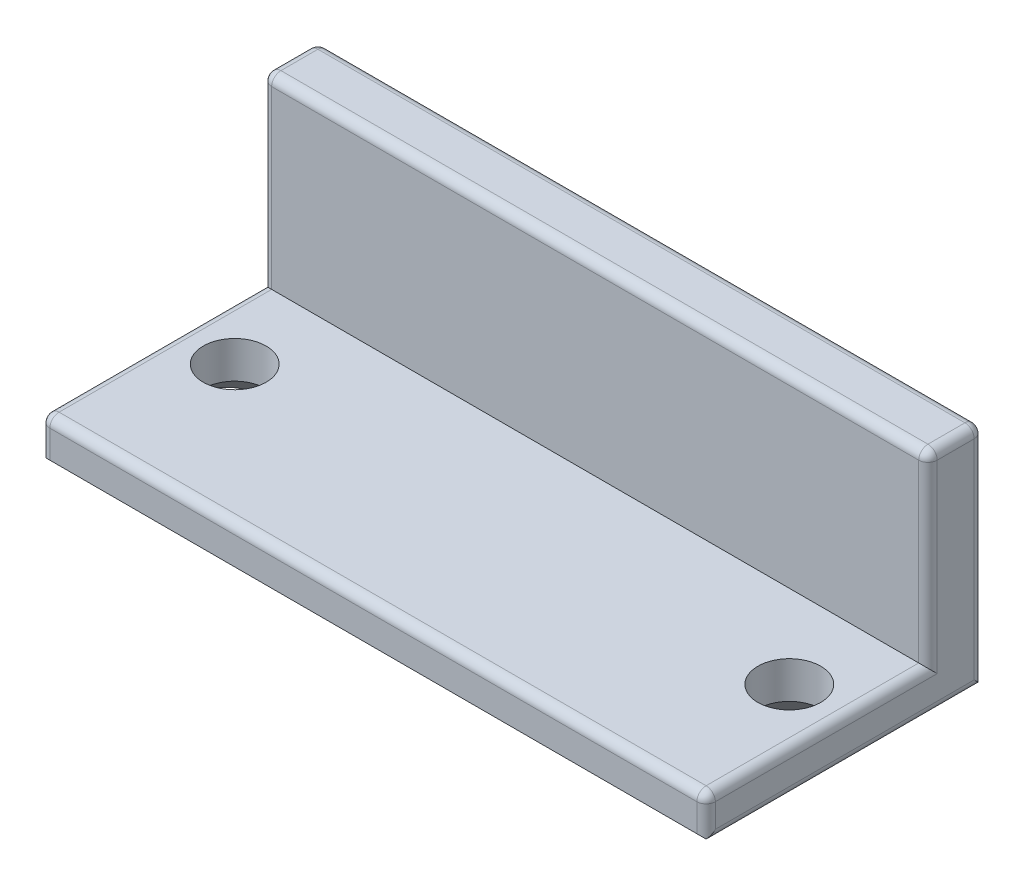
ISO-10303-21;
HEADER;
FILE_DESCRIPTION(('STEP AP214'),'2;1');
FILE_NAME('part.step','',(''),(''),'','','');
FILE_SCHEMA(('AUTOMOTIVE_DESIGN { 1 0 10303 214 1 1 1 1 }'));
ENDSEC;
DATA;
#1=APPLICATION_CONTEXT('core data for automotive mechanical design processes');
#2=APPLICATION_PROTOCOL_DEFINITION('international standard','automotive_design',2000,#1);
#3=PRODUCT_CONTEXT('',#1,'mechanical');
#4=PRODUCT('Part','Part','',(#3));
#5=PRODUCT_RELATED_PRODUCT_CATEGORY('part','',(#4));
#6=PRODUCT_DEFINITION_FORMATION('','',#4);
#7=PRODUCT_DEFINITION_CONTEXT('part definition',#1,'design');
#8=PRODUCT_DEFINITION('design','',#6,#7);
#9=PRODUCT_DEFINITION_SHAPE('','',#8);
#10=(LENGTH_UNIT() NAMED_UNIT(*) SI_UNIT(.MILLI.,.METRE.));
#11=(NAMED_UNIT(*) PLANE_ANGLE_UNIT() SI_UNIT($,.RADIAN.));
#12=(NAMED_UNIT(*) SI_UNIT($,.STERADIAN.) SOLID_ANGLE_UNIT());
#13=UNCERTAINTY_MEASURE_WITH_UNIT(LENGTH_MEASURE(1.E-05),#10,'distance_accuracy_value','');
#14=(GEOMETRIC_REPRESENTATION_CONTEXT(3) GLOBAL_UNCERTAINTY_ASSIGNED_CONTEXT((#13)) GLOBAL_UNIT_ASSIGNED_CONTEXT((#10,
#11,#12)) REPRESENTATION_CONTEXT('',''));
#15=CARTESIAN_POINT('',(0.,0.,0.));
#16=DIRECTION('',(0.,0.,1.));
#17=DIRECTION('',(1.,0.,0.));
#18=AXIS2_PLACEMENT_3D('',#15,#16,#17);
#19=CARTESIAN_POINT('',(0.,4.,0.));
#20=DIRECTION('',(0.,-1.,0.));
#21=DIRECTION('',(0.,0.,-1.));
#22=AXIS2_PLACEMENT_3D('',#19,#20,#21);
#23=PLANE('',#22);
#24=CARTESIAN_POINT('',(15.,4.,0.));
#25=DIRECTION('',(0.,-1.,0.));
#26=DIRECTION('',(0.,0.,-1.));
#27=AXIS2_PLACEMENT_3D('',#24,#25,#26);
#28=CIRCLE('',#27,1.7);
#29=CARTESIAN_POINT('',(15.,4.,-1.7));
#30=VERTEX_POINT('',#29);
#31=EDGE_CURVE('E211',#30,#30,#28,.T.);
#32=ORIENTED_EDGE('',*,*,#31,.T.);
#33=EDGE_LOOP('',(#32));
#34=FACE_BOUND('',#33,.T.);
#35=CARTESIAN_POINT('',(-15.,4.,0.));
#36=DIRECTION('',(0.,-1.,0.));
#37=DIRECTION('',(0.,0.,-1.));
#38=AXIS2_PLACEMENT_3D('',#35,#36,#37);
#39=CIRCLE('',#38,1.7);
#40=CARTESIAN_POINT('',(-15.,4.,-1.7));
#41=VERTEX_POINT('',#40);
#42=EDGE_CURVE('E207',#41,#41,#39,.T.);
#43=ORIENTED_EDGE('',*,*,#42,.T.);
#44=EDGE_LOOP('',(#43));
#45=FACE_BOUND('',#44,.T.);
#46=DIRECTION('',(0.,0.,1.));
#47=VECTOR('',#46,1.);
#48=CARTESIAN_POINT('',(-17.5,4.,0.));
#49=LINE('',#48,#47);
#50=CARTESIAN_POINT('',(-17.5,4.,-4.5));
#51=VERTEX_POINT('',#50);
#52=CARTESIAN_POINT('',(-17.5,4.,7.));
#53=VERTEX_POINT('',#52);
#54=EDGE_CURVE('E508',#51,#53,#49,.T.);
#55=ORIENTED_EDGE('',*,*,#54,.T.);
#56=DIRECTION('',(1.,0.,0.));
#57=VECTOR('',#56,1.);
#58=CARTESIAN_POINT('',(0.,4.,7.));
#59=LINE('',#58,#57);
#60=CARTESIAN_POINT('',(17.5,4.,7.));
#61=VERTEX_POINT('',#60);
#62=EDGE_CURVE('E49',#53,#61,#59,.T.);
#63=ORIENTED_EDGE('',*,*,#62,.T.);
#64=DIRECTION('',(0.,0.,-1.));
#65=VECTOR('',#64,1.);
#66=CARTESIAN_POINT('',(17.5,4.,0.));
#67=LINE('',#66,#65);
#68=CARTESIAN_POINT('',(17.5,4.,-4.5));
#69=VERTEX_POINT('',#68);
#70=EDGE_CURVE('E506',#61,#69,#67,.T.);
#71=ORIENTED_EDGE('',*,*,#70,.T.);
#72=DIRECTION('',(1.,0.,0.));
#73=VECTOR('',#72,1.);
#74=CARTESIAN_POINT('',(-18.,4.,-4.5));
#75=LINE('',#74,#73);
#76=EDGE_CURVE('E559',#51,#69,#75,.T.);
#77=ORIENTED_EDGE('',*,*,#76,.F.);
#78=EDGE_LOOP('',(#55,#63,#71,#77));
#79=FACE_BOUND('',#78,.T.);
#80=ADVANCED_FACE('F40',(#34,#45,#79),#23,.F.);
#81=CARTESIAN_POINT('',(18.,4.,7.5));
#82=DIRECTION('',(-1.,0.,0.));
#83=DIRECTION('',(0.,0.,1.));
#84=AXIS2_PLACEMENT_3D('',#81,#82,#83);
#85=PLANE('',#84);
#86=DIRECTION('',(0.,-1.,0.));
#87=VECTOR('',#86,1.);
#88=CARTESIAN_POINT('',(18.,4.,-5.));
#89=LINE('',#88,#87);
#90=CARTESIAN_POINT('',(18.,13.5,-5.));
#91=VERTEX_POINT('',#90);
#92=CARTESIAN_POINT('',(18.,3.5,-5.));
#93=VERTEX_POINT('',#92);
#94=EDGE_CURVE('E542',#91,#93,#89,.T.);
#95=ORIENTED_EDGE('',*,*,#94,.T.);
#96=DIRECTION('',(0.,0.,-1.));
#97=VECTOR('',#96,1.);
#98=CARTESIAN_POINT('',(18.,3.5,7.5));
#99=LINE('',#98,#97);
#100=CARTESIAN_POINT('',(18.,3.5,7.));
#101=VERTEX_POINT('',#100);
#102=EDGE_CURVE('E543',#93,#101,#99,.F.);
#103=ORIENTED_EDGE('',*,*,#102,.T.);
#104=DIRECTION('',(0.,-1.,0.));
#105=VECTOR('',#104,1.);
#106=CARTESIAN_POINT('',(18.,4.,7.));
#107=LINE('',#106,#105);
#108=CARTESIAN_POINT('',(18.,2.20710678118658,7.));
#109=VERTEX_POINT('',#108);
#110=EDGE_CURVE('E534',#101,#109,#107,.T.);
#111=ORIENTED_EDGE('',*,*,#110,.T.);
#112=DIRECTION('',(0.,0.,-1.));
#113=VECTOR('',#112,1.);
#114=CARTESIAN_POINT('',(18.,2.20710678118658,-7.5));
#115=LINE('',#114,#113);
#116=CARTESIAN_POINT('',(18.,2.20710678118658,-7.));
#117=VERTEX_POINT('',#116);
#118=EDGE_CURVE('E536',#109,#117,#115,.T.);
#119=ORIENTED_EDGE('',*,*,#118,.T.);
#120=DIRECTION('',(0.,-1.,0.));
#121=VECTOR('',#120,1.);
#122=CARTESIAN_POINT('',(18.,4.,-7.));
#123=LINE('',#122,#121);
#124=CARTESIAN_POINT('',(18.,13.5,-7.));
#125=VERTEX_POINT('',#124);
#126=EDGE_CURVE('E538',#117,#125,#123,.F.);
#127=ORIENTED_EDGE('',*,*,#126,.T.);
#128=DIRECTION('',(0.,0.,-1.));
#129=VECTOR('',#128,1.);
#130=CARTESIAN_POINT('',(18.,13.5,-4.5));
#131=LINE('',#130,#129);
#132=EDGE_CURVE('E540',#125,#91,#131,.F.);
#133=ORIENTED_EDGE('',*,*,#132,.T.);
#134=EDGE_LOOP('',(#95,#103,#111,#119,#127,#133));
#135=FACE_BOUND('',#134,.T.);
#136=ADVANCED_FACE('F334',(#135),#85,.F.);
#137=CARTESIAN_POINT('',(-18.,4.,-7.5));
#138=DIRECTION('',(0.,0.,1.));
#139=DIRECTION('',(1.,0.,0.));
#140=AXIS2_PLACEMENT_3D('',#137,#138,#139);
#141=PLANE('',#140);
#142=DIRECTION('',(-1.,0.,0.));
#143=VECTOR('',#142,1.);
#144=CARTESIAN_POINT('',(-18.,2.00000000000004,-7.5));
#145=LINE('',#144,#143);
#146=CARTESIAN_POINT('',(17.5,2.00000000000004,-7.5));
#147=VERTEX_POINT('',#146);
#148=CARTESIAN_POINT('',(-17.5,2.00000000000004,-7.5));
#149=VERTEX_POINT('',#148);
#150=EDGE_CURVE('E204',#147,#149,#145,.T.);
#151=ORIENTED_EDGE('',*,*,#150,.T.);
#152=DIRECTION('',(0.,-1.,0.));
#153=VECTOR('',#152,1.);
#154=CARTESIAN_POINT('',(-17.5,4.,-7.5));
#155=LINE('',#154,#153);
#156=CARTESIAN_POINT('',(-17.5,13.5,-7.5));
#157=VERTEX_POINT('',#156);
#158=EDGE_CURVE('E528',#149,#157,#155,.F.);
#159=ORIENTED_EDGE('',*,*,#158,.T.);
#160=DIRECTION('',(-1.,0.,0.));
#161=VECTOR('',#160,1.);
#162=CARTESIAN_POINT('',(18.,13.5,-7.5));
#163=LINE('',#162,#161);
#164=CARTESIAN_POINT('',(17.5,13.5,-7.5));
#165=VERTEX_POINT('',#164);
#166=EDGE_CURVE('E526',#157,#165,#163,.F.);
#167=ORIENTED_EDGE('',*,*,#166,.T.);
#168=DIRECTION('',(0.,-1.,0.));
#169=VECTOR('',#168,1.);
#170=CARTESIAN_POINT('',(17.5,4.,-7.5));
#171=LINE('',#170,#169);
#172=EDGE_CURVE('E524',#165,#147,#171,.T.);
#173=ORIENTED_EDGE('',*,*,#172,.T.);
#174=EDGE_LOOP('',(#151,#159,#167,#173));
#175=FACE_BOUND('',#174,.T.);
#176=ADVANCED_FACE('F340',(#175),#141,.F.);
#177=CARTESIAN_POINT('',(-18.,4.,7.5));
#178=DIRECTION('',(1.,0.,0.));
#179=DIRECTION('',(0.,0.,-1.));
#180=AXIS2_PLACEMENT_3D('',#177,#178,#179);
#181=PLANE('',#180);
#182=DIRECTION('',(0.,0.,1.));
#183=VECTOR('',#182,1.);
#184=CARTESIAN_POINT('',(-18.,3.5,7.5));
#185=LINE('',#184,#183);
#186=CARTESIAN_POINT('',(-18.,3.5,7.));
#187=VERTEX_POINT('',#186);
#188=CARTESIAN_POINT('',(-18.,3.5,-5.));
#189=VERTEX_POINT('',#188);
#190=EDGE_CURVE('E505',#187,#189,#185,.F.);
#191=ORIENTED_EDGE('',*,*,#190,.T.);
#192=DIRECTION('',(0.,-1.,0.));
#193=VECTOR('',#192,1.);
#194=CARTESIAN_POINT('',(-18.,4.,-5.));
#195=LINE('',#194,#193);
#196=CARTESIAN_POINT('',(-18.,13.5,-5.));
#197=VERTEX_POINT('',#196);
#198=EDGE_CURVE('E503',#189,#197,#195,.F.);
#199=ORIENTED_EDGE('',*,*,#198,.T.);
#200=DIRECTION('',(0.,0.,1.));
#201=VECTOR('',#200,1.);
#202=CARTESIAN_POINT('',(-18.,13.5,-7.5));
#203=LINE('',#202,#201);
#204=CARTESIAN_POINT('',(-18.,13.5,-7.));
#205=VERTEX_POINT('',#204);
#206=EDGE_CURVE('E497',#197,#205,#203,.F.);
#207=ORIENTED_EDGE('',*,*,#206,.T.);
#208=DIRECTION('',(0.,-1.,0.));
#209=VECTOR('',#208,1.);
#210=CARTESIAN_POINT('',(-18.,4.,-7.));
#211=LINE('',#210,#209);
#212=CARTESIAN_POINT('',(-18.,2.20710678118658,-7.));
#213=VERTEX_POINT('',#212);
#214=EDGE_CURVE('E500',#205,#213,#211,.T.);
#215=ORIENTED_EDGE('',*,*,#214,.T.);
#216=DIRECTION('',(0.,0.,1.));
#217=VECTOR('',#216,1.);
#218=CARTESIAN_POINT('',(-18.,2.20710678118658,7.5));
#219=LINE('',#218,#217);
#220=CARTESIAN_POINT('',(-18.,2.20710678118658,7.));
#221=VERTEX_POINT('',#220);
#222=EDGE_CURVE('E600',#213,#221,#219,.T.);
#223=ORIENTED_EDGE('',*,*,#222,.T.);
#224=DIRECTION('',(0.,-1.,0.));
#225=VECTOR('',#224,1.);
#226=CARTESIAN_POINT('',(-18.,4.,7.));
#227=LINE('',#226,#225);
#228=EDGE_CURVE('E409',#221,#187,#227,.F.);
#229=ORIENTED_EDGE('',*,*,#228,.T.);
#230=EDGE_LOOP('',(#191,#199,#207,#215,#223,#229));
#231=FACE_BOUND('',#230,.T.);
#232=ADVANCED_FACE('F354',(#231),#181,.F.);
#233=CARTESIAN_POINT('',(-18.,4.,7.5));
#234=DIRECTION('',(0.,0.,-1.));
#235=DIRECTION('',(-1.,0.,0.));
#236=AXIS2_PLACEMENT_3D('',#233,#234,#235);
#237=PLANE('',#236);
#238=DIRECTION('',(0.,-1.,0.));
#239=VECTOR('',#238,1.);
#240=CARTESIAN_POINT('',(17.5,4.,7.5));
#241=LINE('',#240,#239);
#242=CARTESIAN_POINT('',(17.5,2.00000000000004,7.5));
#243=VERTEX_POINT('',#242);
#244=CARTESIAN_POINT('',(17.5,3.5,7.5));
#245=VERTEX_POINT('',#244);
#246=EDGE_CURVE('E514',#243,#245,#241,.F.);
#247=ORIENTED_EDGE('',*,*,#246,.T.);
#248=DIRECTION('',(1.,0.,0.));
#249=VECTOR('',#248,1.);
#250=CARTESIAN_POINT('',(-18.,3.5,7.5));
#251=LINE('',#250,#249);
#252=CARTESIAN_POINT('',(-17.5,3.5,7.5));
#253=VERTEX_POINT('',#252);
#254=EDGE_CURVE('E11',#245,#253,#251,.F.);
#255=ORIENTED_EDGE('',*,*,#254,.T.);
#256=DIRECTION('',(0.,-1.,0.));
#257=VECTOR('',#256,1.);
#258=CARTESIAN_POINT('',(-17.5,4.,7.5));
#259=LINE('',#258,#257);
#260=CARTESIAN_POINT('',(-17.5,2.00000000000004,7.5));
#261=VERTEX_POINT('',#260);
#262=EDGE_CURVE('E516',#253,#261,#259,.T.);
#263=ORIENTED_EDGE('',*,*,#262,.T.);
#264=DIRECTION('',(1.,0.,0.));
#265=VECTOR('',#264,1.);
#266=CARTESIAN_POINT('',(18.,2.00000000000004,7.5));
#267=LINE('',#266,#265);
#268=EDGE_CURVE('E554',#261,#243,#267,.T.);
#269=ORIENTED_EDGE('',*,*,#268,.T.);
#270=EDGE_LOOP('',(#247,#255,#263,#269));
#271=FACE_BOUND('',#270,.T.);
#272=ADVANCED_FACE('F351',(#271),#237,.F.);
#273=CARTESIAN_POINT('',(0.,0.,0.));
#274=DIRECTION('',(0.,-1.,0.));
#275=DIRECTION('',(0.,0.,-1.));
#276=AXIS2_PLACEMENT_3D('',#273,#274,#275);
#277=PLANE('',#276);
#278=CARTESIAN_POINT('',(-15.,0.,0.));
#279=DIRECTION('',(0.,-1.,0.));
#280=DIRECTION('',(0.,0.,-1.));
#281=AXIS2_PLACEMENT_3D('',#278,#279,#280);
#282=CIRCLE('',#281,3.7);
#283=CARTESIAN_POINT('',(-16.,0.,3.56230262611138));
#284=VERTEX_POINT('',#283);
#285=CARTESIAN_POINT('',(-16.,0.,-3.56230262611138));
#286=VERTEX_POINT('',#285);
#287=EDGE_CURVE('E571',#284,#286,#282,.F.);
#288=ORIENTED_EDGE('',*,*,#287,.T.);
#289=DIRECTION('',(0.,0.,-1.));
#290=VECTOR('',#289,1.);
#291=CARTESIAN_POINT('',(-16.,0.,-7.5));
#292=LINE('',#291,#290);
#293=CARTESIAN_POINT('',(-16.,0.,-5.49999999999999));
#294=VERTEX_POINT('',#293);
#295=EDGE_CURVE('E573',#286,#294,#292,.T.);
#296=ORIENTED_EDGE('',*,*,#295,.T.);
#297=DIRECTION('',(1.,0.,0.));
#298=VECTOR('',#297,1.);
#299=CARTESIAN_POINT('',(18.,0.,-5.49999999999999));
#300=LINE('',#299,#298);
#301=CARTESIAN_POINT('',(16.,0.,-5.49999999999999));
#302=VERTEX_POINT('',#301);
#303=EDGE_CURVE('E193',#294,#302,#300,.T.);
#304=ORIENTED_EDGE('',*,*,#303,.T.);
#305=DIRECTION('',(0.,0.,1.));
#306=VECTOR('',#305,1.);
#307=CARTESIAN_POINT('',(16.,0.,7.5));
#308=LINE('',#307,#306);
#309=CARTESIAN_POINT('',(16.,0.,-3.56230262611139));
#310=VERTEX_POINT('',#309);
#311=EDGE_CURVE('E186',#302,#310,#308,.T.);
#312=ORIENTED_EDGE('',*,*,#311,.T.);
#313=CARTESIAN_POINT('',(15.,0.,0.));
#314=DIRECTION('',(0.,-1.,0.));
#315=DIRECTION('',(0.,0.,-1.));
#316=AXIS2_PLACEMENT_3D('',#313,#314,#315);
#317=CIRCLE('',#316,3.70000000000001);
#318=CARTESIAN_POINT('',(16.,0.,3.56230262611139));
#319=VERTEX_POINT('',#318);
#320=EDGE_CURVE('E190',#310,#319,#317,.F.);
#321=ORIENTED_EDGE('',*,*,#320,.T.);
#322=DIRECTION('',(0.,0.,1.));
#323=VECTOR('',#322,1.);
#324=CARTESIAN_POINT('',(16.,0.,7.5));
#325=LINE('',#324,#323);
#326=CARTESIAN_POINT('',(16.,0.,5.49999999999999));
#327=VERTEX_POINT('',#326);
#328=EDGE_CURVE('E198',#319,#327,#325,.T.);
#329=ORIENTED_EDGE('',*,*,#328,.T.);
#330=DIRECTION('',(-1.,0.,0.));
#331=VECTOR('',#330,1.);
#332=CARTESIAN_POINT('',(-18.,0.,5.49999999999999));
#333=LINE('',#332,#331);
#334=CARTESIAN_POINT('',(-16.,0.,5.49999999999999));
#335=VERTEX_POINT('',#334);
#336=EDGE_CURVE('E197',#327,#335,#333,.T.);
#337=ORIENTED_EDGE('',*,*,#336,.T.);
#338=DIRECTION('',(0.,0.,-1.));
#339=VECTOR('',#338,1.);
#340=CARTESIAN_POINT('',(-16.,0.,-7.5));
#341=LINE('',#340,#339);
#342=EDGE_CURVE('E393',#335,#284,#341,.T.);
#343=ORIENTED_EDGE('',*,*,#342,.T.);
#344=EDGE_LOOP('',(#288,#296,#304,#312,#321,#329,#337,#343));
#345=FACE_BOUND('',#344,.T.);
#346=ADVANCED_FACE('F188',(#345),#277,.T.);
#347=CARTESIAN_POINT('',(-18.,14.,-4.5));
#348=DIRECTION('',(0.,0.,-1.));
#349=DIRECTION('',(-1.,0.,0.));
#350=AXIS2_PLACEMENT_3D('',#347,#348,#349);
#351=PLANE('',#350);
#352=DIRECTION('',(1.,0.,0.));
#353=VECTOR('',#352,1.);
#354=CARTESIAN_POINT('',(-18.,13.5,-4.5));
#355=LINE('',#354,#353);
#356=CARTESIAN_POINT('',(17.5,13.5,-4.5));
#357=VERTEX_POINT('',#356);
#358=CARTESIAN_POINT('',(-17.5,13.5,-4.5));
#359=VERTEX_POINT('',#358);
#360=EDGE_CURVE('E487',#357,#359,#355,.F.);
#361=ORIENTED_EDGE('',*,*,#360,.T.);
#362=DIRECTION('',(0.,-1.,0.));
#363=VECTOR('',#362,1.);
#364=CARTESIAN_POINT('',(-17.5,14.,-4.5));
#365=LINE('',#364,#363);
#366=EDGE_CURVE('E501',#359,#51,#365,.T.);
#367=ORIENTED_EDGE('',*,*,#366,.T.);
#368=ORIENTED_EDGE('',*,*,#76,.T.);
#369=DIRECTION('',(0.,-1.,0.));
#370=VECTOR('',#369,1.);
#371=CARTESIAN_POINT('',(17.5,14.,-4.5));
#372=LINE('',#371,#370);
#373=EDGE_CURVE('E223',#69,#357,#372,.F.);
#374=ORIENTED_EDGE('',*,*,#373,.T.);
#375=EDGE_LOOP('',(#361,#367,#368,#374));
#376=FACE_BOUND('',#375,.T.);
#377=ADVANCED_FACE('F347',(#376),#351,.F.);
#378=CARTESIAN_POINT('',(0.,14.,0.));
#379=DIRECTION('',(0.,1.,0.));
#380=DIRECTION('',(0.,0.,1.));
#381=AXIS2_PLACEMENT_3D('',#378,#379,#380);
#382=PLANE('',#381);
#383=DIRECTION('',(-1.,0.,0.));
#384=VECTOR('',#383,1.);
#385=CARTESIAN_POINT('',(-18.,14.,-7.));
#386=LINE('',#385,#384);
#387=CARTESIAN_POINT('',(17.5,14.,-7.));
#388=VERTEX_POINT('',#387);
#389=CARTESIAN_POINT('',(-17.5,14.,-7.));
#390=VERTEX_POINT('',#389);
#391=EDGE_CURVE('E492',#388,#390,#386,.T.);
#392=ORIENTED_EDGE('',*,*,#391,.T.);
#393=DIRECTION('',(0.,0.,1.));
#394=VECTOR('',#393,1.);
#395=CARTESIAN_POINT('',(-17.5,14.,-4.5));
#396=LINE('',#395,#394);
#397=CARTESIAN_POINT('',(-17.5,14.,-5.));
#398=VERTEX_POINT('',#397);
#399=EDGE_CURVE('E495',#390,#398,#396,.T.);
#400=ORIENTED_EDGE('',*,*,#399,.T.);
#401=DIRECTION('',(1.,0.,0.));
#402=VECTOR('',#401,1.);
#403=CARTESIAN_POINT('',(18.,14.,-5.));
#404=LINE('',#403,#402);
#405=CARTESIAN_POINT('',(17.5,14.,-5.));
#406=VERTEX_POINT('',#405);
#407=EDGE_CURVE('E488',#398,#406,#404,.T.);
#408=ORIENTED_EDGE('',*,*,#407,.T.);
#409=DIRECTION('',(0.,0.,-1.));
#410=VECTOR('',#409,1.);
#411=CARTESIAN_POINT('',(17.5,14.,-7.5));
#412=LINE('',#411,#410);
#413=EDGE_CURVE('E493',#406,#388,#412,.T.);
#414=ORIENTED_EDGE('',*,*,#413,.T.);
#415=EDGE_LOOP('',(#392,#400,#408,#414));
#416=FACE_BOUND('',#415,.T.);
#417=ADVANCED_FACE('F594',(#416),#382,.T.);
#418=CARTESIAN_POINT('',(-15.,8.,0.));
#419=DIRECTION('',(0.,-1.,0.));
#420=DIRECTION('',(0.,0.,-1.));
#421=AXIS2_PLACEMENT_3D('',#418,#419,#420);
#422=CYLINDRICAL_SURFACE('',#421,1.7);
#423=CARTESIAN_POINT('',(-15.,1.99999999999999,0.));
#424=DIRECTION('',(0.,-1.,0.));
#425=DIRECTION('',(0.,0.,-1.));
#426=AXIS2_PLACEMENT_3D('',#423,#424,#425);
#427=CIRCLE('',#426,1.7);
#428=CARTESIAN_POINT('',(-15.,1.99999999999999,-1.7));
#429=VERTEX_POINT('',#428);
#430=EDGE_CURVE('E576',#429,#429,#427,.T.);
#431=ORIENTED_EDGE('',*,*,#430,.T.);
#432=EDGE_LOOP('',(#431));
#433=FACE_BOUND('',#432,.T.);
#434=ORIENTED_EDGE('',*,*,#42,.F.);
#435=EDGE_LOOP('',(#434));
#436=FACE_BOUND('',#435,.T.);
#437=ADVANCED_FACE('F608',(#433,#436),#422,.F.);
#438=CARTESIAN_POINT('',(15.,8.,0.));
#439=DIRECTION('',(0.,-1.,0.));
#440=DIRECTION('',(0.,0.,-1.));
#441=AXIS2_PLACEMENT_3D('',#438,#439,#440);
#442=CYLINDRICAL_SURFACE('',#441,1.7);
#443=CARTESIAN_POINT('',(15.,2.00000000000001,0.));
#444=DIRECTION('',(0.,-1.,0.));
#445=DIRECTION('',(0.,0.,-1.));
#446=AXIS2_PLACEMENT_3D('',#443,#444,#445);
#447=CIRCLE('',#446,1.7);
#448=CARTESIAN_POINT('',(15.,2.00000000000001,-1.7));
#449=VERTEX_POINT('',#448);
#450=EDGE_CURVE('E579',#449,#449,#447,.T.);
#451=ORIENTED_EDGE('',*,*,#450,.T.);
#452=EDGE_LOOP('',(#451));
#453=FACE_BOUND('',#452,.T.);
#454=ORIENTED_EDGE('',*,*,#31,.F.);
#455=EDGE_LOOP('',(#454));
#456=FACE_BOUND('',#455,.T.);
#457=ADVANCED_FACE('F236',(#453,#456),#442,.F.);
#458=CARTESIAN_POINT('',(15.,2.00000000000001,0.));
#459=DIRECTION('',(0.,-1.,0.));
#460=DIRECTION('',(0.,0.,-1.));
#461=AXIS2_PLACEMENT_3D('',#458,#459,#460);
#462=CONICAL_SURFACE('',#461,1.7,0.785398163397449);
#463=ORIENTED_EDGE('',*,*,#450,.F.);
#464=EDGE_LOOP('',(#463));
#465=FACE_BOUND('',#464,.T.);
#466=CARTESIAN_POINT('',(15.9998,-0.000199999999998704,3.56256649060759));
#467=CARTESIAN_POINT('',(16.0465130595986,0.0465130595985837,3.50093464861042));
#468=CARTESIAN_POINT('',(16.0926643449181,0.0926643449181048,3.43845412136017));
#469=CARTESIAN_POINT('',(16.1837139874336,0.183713987433581,3.31166345949694));
#470=CARTESIAN_POINT('',(16.2286120341937,0.228612034193754,3.24735287939592));
#471=CARTESIAN_POINT('',(16.3615380187308,0.361538018730841,3.05102153464726));
#472=CARTESIAN_POINT('',(16.4474362166133,0.447436216613293,2.91607346024803));
#473=CARTESIAN_POINT('',(16.6136105767967,0.613610576796723,2.63481188906168));
#474=CARTESIAN_POINT('',(16.6937423150924,0.693742315092382,2.48832664163045));
#475=CARTESIAN_POINT('',(16.8441692808538,0.84416928085385,2.18577885023922));
#476=CARTESIAN_POINT('',(16.9144810906658,0.914481090665851,2.02973310781613));
#477=CARTESIAN_POINT('',(17.0148783814284,1.01487838142841,1.77721915827932));
#478=CARTESIAN_POINT('',(17.0492232472894,1.04922324728945,1.68412256704296));
#479=CARTESIAN_POINT('',(17.1132635635296,1.11326356352966,1.49475269889878));
#480=CARTESIAN_POINT('',(17.1429588175248,1.1429588175248,1.39847928802054));
#481=CARTESIAN_POINT('',(17.1969142605689,1.19691426056888,1.20351733869541));
#482=CARTESIAN_POINT('',(17.2212030149292,1.2212030149292,1.10484470460807));
#483=CARTESIAN_POINT('',(17.2639307288815,1.26393072888156,0.905002458351106));
#484=CARTESIAN_POINT('',(17.2823709502057,1.28237095020577,0.803833389832212));
#485=CARTESIAN_POINT('',(17.3130452500828,1.31304525008279,0.598370865799546));
#486=CARTESIAN_POINT('',(17.3252038209756,1.32520382097561,0.494054661944269));
#487=CARTESIAN_POINT('',(17.3425738768034,1.34257387680341,0.284263577501302));
#488=CARTESIAN_POINT('',(17.3477854860983,1.34778548609834,0.178788717689191));
#489=CARTESIAN_POINT('',(17.3510755304681,1.35107553046808,-0.0324572677547005));
#490=CARTESIAN_POINT('',(17.3491490759384,1.34914907593844,-0.138228546856991));
#491=CARTESIAN_POINT('',(17.3382221585016,1.33822215850165,-0.349029898393682));
#492=CARTESIAN_POINT('',(17.3292219004495,1.32922190044951,-0.454059992203689));
#493=CARTESIAN_POINT('',(17.3057415648923,1.30574156489236,-0.651743527903896));
#494=CARTESIAN_POINT('',(17.2919224914374,1.29192249143739,-0.744556111122211));
#495=CARTESIAN_POINT('',(17.2592091991471,1.25920919914716,-0.928382687575615));
#496=CARTESIAN_POINT('',(17.2403133999239,1.24031339992388,-1.01939611124324));
#497=CARTESIAN_POINT('',(17.1766318962636,1.17663189626361,-1.28916582929989));
#498=CARTESIAN_POINT('',(17.1248484969175,1.1248484969175,-1.46468000712414));
#499=CARTESIAN_POINT('',(17.01586430778,1.01586430777999,-1.77804981479558));
#500=CARTESIAN_POINT('',(16.9608263753693,0.960826375369358,-1.91746230480538));
#501=CARTESIAN_POINT('',(16.8422529117401,0.842252911740086,-2.18888758195588));
#502=CARTESIAN_POINT('',(16.7787145493285,0.778714549328565,-2.32089788280983));
#503=CARTESIAN_POINT('',(16.6446914563211,0.644691456321124,-2.57807825988468));
#504=CARTESIAN_POINT('',(16.5741904425753,0.574190442575285,-2.70323118411444));
#505=CARTESIAN_POINT('',(16.4277403386827,0.427740338682694,-2.94687512612109));
#506=CARTESIAN_POINT('',(16.3517932789287,0.351793278928726,-3.06536859758535));
#507=CARTESIAN_POINT('',(16.2292284015712,0.229228401571269,-3.24646817961319));
#508=CARTESIAN_POINT('',(16.1841031655387,0.184103165538681,-3.31111764902292));
#509=CARTESIAN_POINT('',(16.0927688446209,0.0927688446209657,-3.43831242752018));
#510=CARTESIAN_POINT('',(16.0465651689531,0.0465651689531099,-3.50086549860923));
#511=CARTESIAN_POINT('',(15.9998,-0.000199999999971741,-3.56256649060763));
#512=B_SPLINE_CURVE_WITH_KNOTS('',3,(#466,#467,#468,#469,#470,#471,#472,#473,#474,#475,#476,
#477,#478,#479,#480,#481,#482,#483,#484,#485,#486,#487,#488,#489,#490,#491,#492,#493,#494,#495,
#496,#497,#498,#499,#500,#501,#502,#503,#504,#505,#506,#507,#508,#509,#510,#511),.UNSPECIFIED.,
.F.,.F.,(4,2,2,2,2,2,2,2,2,2,2,2,2,2,2,2,2,2,2,2,2,2,4),(0.,0.2710281319389,0.54212281411283,
1.0863972741464,1.64141409836788,2.19548206287321,2.51028672706824,2.82510468397311,
3.13821758361146,3.45126288787701,3.76798834056443,4.08470812336487,4.40164490067658,
4.71857249994258,5.00280907672809,5.28713423927357,5.85569878590708,6.33406032216532,
6.8125815822536,7.29224969727919,7.77173990317003,8.04423220313069,8.31556867965648),.UNSPECIFIED.);
#513=EDGE_CURVE('E202',#319,#310,#512,.T.);
#514=ORIENTED_EDGE('',*,*,#513,.F.);
#515=ORIENTED_EDGE('',*,*,#320,.F.);
#516=EDGE_LOOP('',(#514,#515));
#517=FACE_BOUND('',#516,.T.);
#518=ADVANCED_FACE('F201',(#465,#517),#462,.F.);
#519=CARTESIAN_POINT('',(-18.,2.00000000000004,7.5));
#520=DIRECTION('',(0.,-0.707106781186544,0.707106781186551));
#521=DIRECTION('',(-1.,0.,0.));
#522=AXIS2_PLACEMENT_3D('',#519,#520,#521);
#523=PLANE('',#522);
#524=ORIENTED_EDGE('',*,*,#268,.F.);
#525=CARTESIAN_POINT('',(-17.5,1.50000000000003,7.));
#526=DIRECTION('',(0.,-0.707106781186544,0.707106781186551));
#527=DIRECTION('',(0.,-0.707106781186551,-0.707106781186544));
#528=AXIS2_PLACEMENT_3D('',#525,#526,#527);
#529=ELLIPSE('',#528,0.707106781186551,0.5);
#530=CARTESIAN_POINT('',(-17.8535533905933,1.85355339059331,7.35355339059328));
#531=VERTEX_POINT('',#530);
#532=EDGE_CURVE('E404',#261,#531,#529,.T.);
#533=ORIENTED_EDGE('',*,*,#532,.T.);
#534=DIRECTION('',(0.577350269189624,-0.57735026918963,-0.577350269189624));
#535=VECTOR('',#534,1.);
#536=CARTESIAN_POINT('',(-18.,2.00000000000004,7.5));
#537=LINE('',#536,#535);
#538=EDGE_CURVE('E213',#335,#531,#537,.F.);
#539=ORIENTED_EDGE('',*,*,#538,.F.);
#540=ORIENTED_EDGE('',*,*,#336,.F.);
#541=DIRECTION('',(-0.577350269189624,-0.57735026918963,-0.577350269189624));
#542=VECTOR('',#541,1.);
#543=CARTESIAN_POINT('',(18.,2.00000000000004,7.5));
#544=LINE('',#543,#542);
#545=CARTESIAN_POINT('',(17.8535533905933,1.85355339059331,7.35355339059327));
#546=VERTEX_POINT('',#545);
#547=EDGE_CURVE('E208',#546,#327,#544,.T.);
#548=ORIENTED_EDGE('',*,*,#547,.F.);
#549=CARTESIAN_POINT('',(17.5,1.50000000000003,7.));
#550=DIRECTION('',(0.,-0.707106781186544,0.707106781186551));
#551=DIRECTION('',(0.,-0.707106781186551,-0.707106781186544));
#552=AXIS2_PLACEMENT_3D('',#549,#550,#551);
#553=ELLIPSE('',#552,0.707106781186551,0.5);
#554=EDGE_CURVE('E518',#546,#243,#553,.T.);
#555=ORIENTED_EDGE('',*,*,#554,.T.);
#556=EDGE_LOOP('',(#524,#533,#539,#540,#548,#555));
#557=FACE_BOUND('',#556,.T.);
#558=ADVANCED_FACE('F235',(#557),#523,.T.);
#559=CARTESIAN_POINT('',(-15.,1.99999999999999,0.));
#560=DIRECTION('',(0.,-1.,0.));
#561=DIRECTION('',(0.,0.,-1.));
#562=AXIS2_PLACEMENT_3D('',#559,#560,#561);
#563=CONICAL_SURFACE('',#562,1.7,0.785398163397451);
#564=ORIENTED_EDGE('',*,*,#430,.F.);
#565=EDGE_LOOP('',(#564));
#566=FACE_BOUND('',#565,.T.);
#567=CARTESIAN_POINT('',(-15.9998,-0.000199999999998584,-3.56256649060759));
#568=CARTESIAN_POINT('',(-16.0465130595986,0.0465130595985836,-3.50093464861042));
#569=CARTESIAN_POINT('',(-16.0926643449181,0.0926643449181044,-3.43845412136016));
#570=CARTESIAN_POINT('',(-16.1837139874336,0.18371398743358,-3.31166345949693));
#571=CARTESIAN_POINT('',(-16.2286120341937,0.228612034193754,-3.24735287939592));
#572=CARTESIAN_POINT('',(-16.3615380187308,0.36153801873084,-3.05102153464726));
#573=CARTESIAN_POINT('',(-16.4474362166133,0.44743621661329,-2.91607346024803));
#574=CARTESIAN_POINT('',(-16.6136105767967,0.613610576796719,-2.63481188906168));
#575=CARTESIAN_POINT('',(-16.6937423150924,0.693742315092378,-2.48832664163045));
#576=CARTESIAN_POINT('',(-16.8441692808538,0.844169280853845,-2.18577885023921));
#577=CARTESIAN_POINT('',(-16.9144810906658,0.914481090665845,-2.02973310781613));
#578=CARTESIAN_POINT('',(-17.0148783814284,1.0148783814284,-1.77721915827932));
#579=CARTESIAN_POINT('',(-17.0492232472894,1.04922324728944,-1.68412256704296));
#580=CARTESIAN_POINT('',(-17.1132635635296,1.11326356352965,-1.49475269889877));
#581=CARTESIAN_POINT('',(-17.1429588175248,1.14295881752479,-1.39847928802054));
#582=CARTESIAN_POINT('',(-17.1969142605688,1.19691426056888,-1.20351733869541));
#583=CARTESIAN_POINT('',(-17.2212030149292,1.2212030149292,-1.10484470460807));
#584=CARTESIAN_POINT('',(-17.2639307288815,1.26393072888155,-0.905002458351104));
#585=CARTESIAN_POINT('',(-17.2823709502057,1.28237095020577,-0.80383338983221));
#586=CARTESIAN_POINT('',(-17.3130452500828,1.31304525008278,-0.598370865799544));
#587=CARTESIAN_POINT('',(-17.3252038209756,1.3252038209756,-0.494054661944267));
#588=CARTESIAN_POINT('',(-17.3425738768034,1.34257387680341,-0.284263577501301));
#589=CARTESIAN_POINT('',(-17.3477854860983,1.34778548609834,-0.17878871768919));
#590=CARTESIAN_POINT('',(-17.351075530468,1.35107553046808,0.0324572677547012));
#591=CARTESIAN_POINT('',(-17.3491490759384,1.34914907593843,0.138228546856992));
#592=CARTESIAN_POINT('',(-17.3382221585016,1.33822215850164,0.349029898393682));
#593=CARTESIAN_POINT('',(-17.3292219004495,1.3292219004495,0.45405999220369));
#594=CARTESIAN_POINT('',(-17.3057415648923,1.30574156489235,0.651743527903898));
#595=CARTESIAN_POINT('',(-17.2919224914373,1.29192249143738,0.744556111122212));
#596=CARTESIAN_POINT('',(-17.2592091991471,1.25920919914715,0.928382687575617));
#597=CARTESIAN_POINT('',(-17.2403133999238,1.24031339992387,1.01939611124324));
#598=CARTESIAN_POINT('',(-17.1766318962636,1.1766318962636,1.28916582929989));
#599=CARTESIAN_POINT('',(-17.1248484969175,1.12484849691749,1.46468000712414));
#600=CARTESIAN_POINT('',(-17.01586430778,1.01586430777998,1.77804981479558));
#601=CARTESIAN_POINT('',(-16.9608263753693,0.960826375369348,1.91746230480538));
#602=CARTESIAN_POINT('',(-16.8422529117401,0.842252911740076,2.18888758195588));
#603=CARTESIAN_POINT('',(-16.7787145493285,0.778714549328555,2.32089788280983));
#604=CARTESIAN_POINT('',(-16.6446914563211,0.644691456321114,2.57807825988468));
#605=CARTESIAN_POINT('',(-16.5741904425753,0.574190442575274,2.70323118411445));
#606=CARTESIAN_POINT('',(-16.4277403386827,0.427740338682682,2.94687512612109));
#607=CARTESIAN_POINT('',(-16.3517932789287,0.351793278928714,3.06536859758535));
#608=CARTESIAN_POINT('',(-16.2292284015712,0.229228401571259,3.24646817961319));
#609=CARTESIAN_POINT('',(-16.1841031655387,0.184103165538673,3.31111764902292));
#610=CARTESIAN_POINT('',(-16.0927688446209,0.0927688446209619,3.43831242752018));
#611=CARTESIAN_POINT('',(-16.0465651689531,0.0465651689531081,3.50086549860922));
#612=CARTESIAN_POINT('',(-15.9998,-0.000199999999971379,3.56256649060762));
#613=B_SPLINE_CURVE_WITH_KNOTS('',3,(#567,#568,#569,#570,#571,#572,#573,#574,#575,#576,#577,
#578,#579,#580,#581,#582,#583,#584,#585,#586,#587,#588,#589,#590,#591,#592,#593,#594,#595,#596,
#597,#598,#599,#600,#601,#602,#603,#604,#605,#606,#607,#608,#609,#610,#611,#612),.UNSPECIFIED.,
.F.,.F.,(4,2,2,2,2,2,2,2,2,2,2,2,2,2,2,2,2,2,2,2,2,2,4),(0.,0.271028131938899,0.542122814112829,
1.0863972741464,1.64141409836787,2.1954820628732,2.51028672706823,2.8251046839731,
3.13821758361145,3.451262887877,3.76798834056443,4.08470812336486,4.40164490067657,
4.71857249994257,5.00280907672808,5.28713423927356,5.85569878590707,6.33406032216531,
6.81258158225359,7.29224969727918,7.77173990317002,8.04423220313067,8.31556867965645),.UNSPECIFIED.);
#614=EDGE_CURVE('E376',#286,#284,#613,.T.);
#615=ORIENTED_EDGE('',*,*,#614,.F.);
#616=ORIENTED_EDGE('',*,*,#287,.F.);
#617=EDGE_LOOP('',(#615,#616));
#618=FACE_BOUND('',#617,.T.);
#619=ADVANCED_FACE('F244',(#566,#618),#563,.F.);
#620=CARTESIAN_POINT('',(18.,2.00000000000004,7.5));
#621=DIRECTION('',(0.707106781186551,-0.707106781186544,0.));
#622=DIRECTION('',(0.,0.,1.));
#623=AXIS2_PLACEMENT_3D('',#620,#621,#622);
#624=PLANE('',#623);
#625=DIRECTION('',(0.577350269189624,0.57735026918963,-0.577350269189624));
#626=VECTOR('',#625,1.);
#627=CARTESIAN_POINT('',(13.,-2.99999999999998,-2.50000000000004));
#628=LINE('',#627,#626);
#629=CARTESIAN_POINT('',(17.8535533905933,1.85355339059331,-7.35355339059327));
#630=VERTEX_POINT('',#629);
#631=EDGE_CURVE('E383',#630,#302,#628,.F.);
#632=ORIENTED_EDGE('',*,*,#631,.F.);
#633=DIRECTION('',(0.,0.,-1.));
#634=VECTOR('',#633,1.);
#635=CARTESIAN_POINT('',(17.8535533905933,1.85355339059331,7.5));
#636=LINE('',#635,#634);
#637=EDGE_CURVE('E459',#630,#546,#636,.F.);
#638=ORIENTED_EDGE('',*,*,#637,.T.);
#639=ORIENTED_EDGE('',*,*,#547,.T.);
#640=ORIENTED_EDGE('',*,*,#328,.F.);
#641=ORIENTED_EDGE('',*,*,#513,.T.);
#642=ORIENTED_EDGE('',*,*,#311,.F.);
#643=EDGE_LOOP('',(#632,#638,#639,#640,#641,#642));
#644=FACE_BOUND('',#643,.T.);
#645=ADVANCED_FACE('F206',(#644),#624,.T.);
#646=CARTESIAN_POINT('',(-18.,2.00000000000004,7.5));
#647=DIRECTION('',(-0.707106781186551,-0.707106781186544,0.));
#648=DIRECTION('',(0.,0.,-1.));
#649=AXIS2_PLACEMENT_3D('',#646,#647,#648);
#650=PLANE('',#649);
#651=ORIENTED_EDGE('',*,*,#538,.T.);
#652=DIRECTION('',(0.,0.,1.));
#653=VECTOR('',#652,1.);
#654=CARTESIAN_POINT('',(-17.8535533905933,1.85355339059331,-7.5));
#655=LINE('',#654,#653);
#656=CARTESIAN_POINT('',(-17.8535533905933,1.85355339059331,-7.35355339059327));
#657=VERTEX_POINT('',#656);
#658=EDGE_CURVE('E391',#531,#657,#655,.F.);
#659=ORIENTED_EDGE('',*,*,#658,.T.);
#660=DIRECTION('',(0.577350269189624,-0.57735026918963,0.577350269189624));
#661=VECTOR('',#660,1.);
#662=CARTESIAN_POINT('',(-13.,-2.99999999999998,-2.50000000000004));
#663=LINE('',#662,#661);
#664=EDGE_CURVE('E454',#294,#657,#663,.F.);
#665=ORIENTED_EDGE('',*,*,#664,.F.);
#666=ORIENTED_EDGE('',*,*,#295,.F.);
#667=ORIENTED_EDGE('',*,*,#614,.T.);
#668=ORIENTED_EDGE('',*,*,#342,.F.);
#669=EDGE_LOOP('',(#651,#659,#665,#666,#667,#668));
#670=FACE_BOUND('',#669,.T.);
#671=ADVANCED_FACE('F243',(#670),#650,.T.);
#672=CARTESIAN_POINT('',(-18.,2.00000000000004,-7.5));
#673=DIRECTION('',(0.,-0.707106781186544,-0.707106781186551));
#674=DIRECTION('',(1.,0.,0.));
#675=AXIS2_PLACEMENT_3D('',#672,#673,#674);
#676=PLANE('',#675);
#677=ORIENTED_EDGE('',*,*,#664,.T.);
#678=CARTESIAN_POINT('',(-17.5,1.50000000000003,-7.));
#679=DIRECTION('',(0.,-0.707106781186544,-0.707106781186551));
#680=DIRECTION('',(0.,-0.707106781186551,0.707106781186544));
#681=AXIS2_PLACEMENT_3D('',#678,#679,#680);
#682=ELLIPSE('',#681,0.707106781186551,0.5);
#683=EDGE_CURVE('E522',#657,#149,#682,.T.);
#684=ORIENTED_EDGE('',*,*,#683,.T.);
#685=ORIENTED_EDGE('',*,*,#150,.F.);
#686=CARTESIAN_POINT('',(17.5,1.50000000000003,-7.));
#687=DIRECTION('',(0.,-0.707106781186544,-0.707106781186551));
#688=DIRECTION('',(0.,-0.707106781186551,0.707106781186544));
#689=AXIS2_PLACEMENT_3D('',#686,#687,#688);
#690=ELLIPSE('',#689,0.707106781186551,0.5);
#691=EDGE_CURVE('E403',#147,#630,#690,.T.);
#692=ORIENTED_EDGE('',*,*,#691,.T.);
#693=ORIENTED_EDGE('',*,*,#631,.T.);
#694=ORIENTED_EDGE('',*,*,#303,.F.);
#695=EDGE_LOOP('',(#677,#684,#685,#692,#693,#694));
#696=FACE_BOUND('',#695,.T.);
#697=ADVANCED_FACE('F320',(#696),#676,.T.);
#698=CARTESIAN_POINT('',(17.5,2.20710678118658,7.5));
#699=DIRECTION('',(0.,0.,1.));
#700=DIRECTION('',(1.,0.,0.));
#701=AXIS2_PLACEMENT_3D('',#698,#699,#700);
#702=CYLINDRICAL_SURFACE('',#701,0.5);
#703=CARTESIAN_POINT('',(17.5,2.20710678118658,7.));
#704=DIRECTION('',(0.,-0.707106781186547,-0.707106781186547));
#705=DIRECTION('',(0.,-0.707106781186547,0.707106781186547));
#706=AXIS2_PLACEMENT_3D('',#703,#704,#705);
#707=ELLIPSE('',#706,0.707106781186547,0.5);
#708=EDGE_CURVE('E448',#546,#109,#707,.F.);
#709=ORIENTED_EDGE('',*,*,#708,.F.);
#710=ORIENTED_EDGE('',*,*,#637,.F.);
#711=CARTESIAN_POINT('',(17.5,2.20710678118658,-7.));
#712=DIRECTION('',(0.,-0.707106781186547,0.707106781186547));
#713=DIRECTION('',(0.,0.707106781186547,0.707106781186547));
#714=AXIS2_PLACEMENT_3D('',#711,#712,#713);
#715=ELLIPSE('',#714,0.707106781186547,0.5);
#716=EDGE_CURVE('E451',#117,#630,#715,.F.);
#717=ORIENTED_EDGE('',*,*,#716,.F.);
#718=ORIENTED_EDGE('',*,*,#118,.F.);
#719=EDGE_LOOP('',(#709,#710,#717,#718));
#720=FACE_BOUND('',#719,.T.);
#721=ADVANCED_FACE('F316',(#720),#702,.T.);
#722=CARTESIAN_POINT('',(17.5,4.,-7.));
#723=DIRECTION('',(0.,-1.,0.));
#724=DIRECTION('',(0.,0.,-1.));
#725=AXIS2_PLACEMENT_3D('',#722,#723,#724);
#726=CYLINDRICAL_SURFACE('',#725,0.5);
#727=ORIENTED_EDGE('',*,*,#691,.F.);
#728=ORIENTED_EDGE('',*,*,#172,.F.);
#729=CARTESIAN_POINT('',(17.5,13.5,-7.));
#730=DIRECTION('',(0.,1.,0.));
#731=DIRECTION('',(0.,0.,1.));
#732=AXIS2_PLACEMENT_3D('',#729,#730,#731);
#733=CIRCLE('',#732,0.5);
#734=EDGE_CURVE('E445',#125,#165,#733,.T.);
#735=ORIENTED_EDGE('',*,*,#734,.F.);
#736=ORIENTED_EDGE('',*,*,#126,.F.);
#737=ORIENTED_EDGE('',*,*,#716,.T.);
#738=EDGE_LOOP('',(#727,#728,#735,#736,#737));
#739=FACE_BOUND('',#738,.T.);
#740=ADVANCED_FACE('F313',(#739),#726,.T.);
#741=CARTESIAN_POINT('',(17.5,4.,7.));
#742=DIRECTION('',(0.,-1.,0.));
#743=DIRECTION('',(0.,0.,-1.));
#744=AXIS2_PLACEMENT_3D('',#741,#742,#743);
#745=CYLINDRICAL_SURFACE('',#744,0.5);
#746=ORIENTED_EDGE('',*,*,#110,.F.);
#747=CARTESIAN_POINT('',(17.5,3.5,7.));
#748=DIRECTION('',(0.,-1.,0.));
#749=DIRECTION('',(0.,0.,-1.));
#750=AXIS2_PLACEMENT_3D('',#747,#748,#749);
#751=CIRCLE('',#750,0.5);
#752=EDGE_CURVE('E57',#101,#245,#751,.T.);
#753=ORIENTED_EDGE('',*,*,#752,.T.);
#754=ORIENTED_EDGE('',*,*,#246,.F.);
#755=ORIENTED_EDGE('',*,*,#554,.F.);
#756=ORIENTED_EDGE('',*,*,#708,.T.);
#757=EDGE_LOOP('',(#746,#753,#754,#755,#756));
#758=FACE_BOUND('',#757,.T.);
#759=ADVANCED_FACE('F309',(#758),#745,.T.);
#760=CARTESIAN_POINT('',(17.5,13.5,-7.));
#761=DIRECTION('',(0.,0.,-1.));
#762=DIRECTION('',(-1.,0.,0.));
#763=AXIS2_PLACEMENT_3D('',#760,#761,#762);
#764=SPHERICAL_SURFACE('',#763,0.5);
#765=CARTESIAN_POINT('',(17.5,13.5,-7.));
#766=DIRECTION('',(0.,0.,-1.));
#767=DIRECTION('',(-1.,0.,0.));
#768=AXIS2_PLACEMENT_3D('',#765,#766,#767);
#769=CIRCLE('',#768,0.5);
#770=EDGE_CURVE('E439',#125,#388,#769,.F.);
#771=ORIENTED_EDGE('',*,*,#770,.F.);
#772=ORIENTED_EDGE('',*,*,#734,.T.);
#773=CARTESIAN_POINT('',(17.5,13.5,-7.));
#774=DIRECTION('',(1.,0.,0.));
#775=DIRECTION('',(0.,0.,-1.));
#776=AXIS2_PLACEMENT_3D('',#773,#774,#775);
#777=CIRCLE('',#776,0.5);
#778=EDGE_CURVE('E442',#388,#165,#777,.F.);
#779=ORIENTED_EDGE('',*,*,#778,.F.);
#780=EDGE_LOOP('',(#771,#772,#779));
#781=FACE_BOUND('',#780,.T.);
#782=ADVANCED_FACE('F305',(#781),#764,.T.);
#783=CARTESIAN_POINT('',(17.5,3.5,0.));
#784=DIRECTION('',(0.,0.,-1.));
#785=DIRECTION('',(-1.,0.,0.));
#786=AXIS2_PLACEMENT_3D('',#783,#784,#785);
#787=CYLINDRICAL_SURFACE('',#786,0.5);
#788=ORIENTED_EDGE('',*,*,#70,.F.);
#789=CARTESIAN_POINT('',(17.5,3.5,7.));
#790=DIRECTION('',(0.,0.,-1.));
#791=DIRECTION('',(-1.,0.,0.));
#792=AXIS2_PLACEMENT_3D('',#789,#790,#791);
#793=CIRCLE('',#792,0.5);
#794=EDGE_CURVE('E461',#61,#101,#793,.T.);
#795=ORIENTED_EDGE('',*,*,#794,.T.);
#796=ORIENTED_EDGE('',*,*,#102,.F.);
#797=CARTESIAN_POINT('',(17.5,3.5,-5.));
#798=DIRECTION('',(0.,0.707106781186547,-0.707106781186547));
#799=DIRECTION('',(0.,-0.707106781186547,-0.707106781186547));
#800=AXIS2_PLACEMENT_3D('',#797,#798,#799);
#801=ELLIPSE('',#800,0.707106781186547,0.5);
#802=EDGE_CURVE('E436',#69,#93,#801,.T.);
#803=ORIENTED_EDGE('',*,*,#802,.F.);
#804=EDGE_LOOP('',(#788,#795,#796,#803));
#805=FACE_BOUND('',#804,.T.);
#806=ADVANCED_FACE('F301',(#805),#787,.T.);
#807=CARTESIAN_POINT('',(0.,13.5,-7.));
#808=DIRECTION('',(1.,0.,0.));
#809=DIRECTION('',(0.,0.,-1.));
#810=AXIS2_PLACEMENT_3D('',#807,#808,#809);
#811=CYLINDRICAL_SURFACE('',#810,0.5);
#812=ORIENTED_EDGE('',*,*,#778,.T.);
#813=ORIENTED_EDGE('',*,*,#166,.F.);
#814=CARTESIAN_POINT('',(-17.5,13.5,-7.));
#815=DIRECTION('',(-1.,0.,0.));
#816=DIRECTION('',(0.,0.,1.));
#817=AXIS2_PLACEMENT_3D('',#814,#815,#816);
#818=CIRCLE('',#817,0.5);
#819=EDGE_CURVE('E430',#390,#157,#818,.T.);
#820=ORIENTED_EDGE('',*,*,#819,.F.);
#821=ORIENTED_EDGE('',*,*,#391,.F.);
#822=EDGE_LOOP('',(#812,#813,#820,#821));
#823=FACE_BOUND('',#822,.T.);
#824=ADVANCED_FACE('F297',(#823),#811,.T.);
#825=CARTESIAN_POINT('',(17.5,13.5,0.));
#826=DIRECTION('',(0.,0.,1.));
#827=DIRECTION('',(1.,0.,0.));
#828=AXIS2_PLACEMENT_3D('',#825,#826,#827);
#829=CYLINDRICAL_SURFACE('',#828,0.5);
#830=ORIENTED_EDGE('',*,*,#770,.T.);
#831=ORIENTED_EDGE('',*,*,#413,.F.);
#832=CARTESIAN_POINT('',(17.5,13.5,-5.));
#833=DIRECTION('',(0.,0.,1.));
#834=DIRECTION('',(1.,0.,0.));
#835=AXIS2_PLACEMENT_3D('',#832,#833,#834);
#836=CIRCLE('',#835,0.5);
#837=EDGE_CURVE('E427',#91,#406,#836,.T.);
#838=ORIENTED_EDGE('',*,*,#837,.F.);
#839=ORIENTED_EDGE('',*,*,#132,.F.);
#840=EDGE_LOOP('',(#830,#831,#838,#839));
#841=FACE_BOUND('',#840,.T.);
#842=ADVANCED_FACE('F293',(#841),#829,.T.);
#843=CARTESIAN_POINT('',(17.5,4.,-5.));
#844=DIRECTION('',(0.,-1.,0.));
#845=DIRECTION('',(0.,0.,-1.));
#846=AXIS2_PLACEMENT_3D('',#843,#844,#845);
#847=CYLINDRICAL_SURFACE('',#846,0.5);
#848=ORIENTED_EDGE('',*,*,#802,.T.);
#849=ORIENTED_EDGE('',*,*,#94,.F.);
#850=CARTESIAN_POINT('',(17.5,13.5,-5.));
#851=DIRECTION('',(0.,1.,0.));
#852=DIRECTION('',(0.,0.,1.));
#853=AXIS2_PLACEMENT_3D('',#850,#851,#852);
#854=CIRCLE('',#853,0.5);
#855=EDGE_CURVE('E424',#357,#91,#854,.T.);
#856=ORIENTED_EDGE('',*,*,#855,.F.);
#857=ORIENTED_EDGE('',*,*,#373,.F.);
#858=EDGE_LOOP('',(#848,#849,#856,#857));
#859=FACE_BOUND('',#858,.T.);
#860=ADVANCED_FACE('F289',(#859),#847,.T.);
#861=CARTESIAN_POINT('',(-17.5,4.,-7.));
#862=DIRECTION('',(0.,-1.,0.));
#863=DIRECTION('',(0.,0.,-1.));
#864=AXIS2_PLACEMENT_3D('',#861,#862,#863);
#865=CYLINDRICAL_SURFACE('',#864,0.5);
#866=CARTESIAN_POINT('',(-17.5,13.5,-7.));
#867=DIRECTION('',(0.,1.,0.));
#868=DIRECTION('',(0.,0.,1.));
#869=AXIS2_PLACEMENT_3D('',#866,#867,#868);
#870=CIRCLE('',#869,0.5);
#871=EDGE_CURVE('E433',#157,#205,#870,.T.);
#872=ORIENTED_EDGE('',*,*,#871,.F.);
#873=ORIENTED_EDGE('',*,*,#158,.F.);
#874=ORIENTED_EDGE('',*,*,#683,.F.);
#875=CARTESIAN_POINT('',(-17.5,2.20710678118658,-7.));
#876=DIRECTION('',(0.,-0.707106781186547,0.707106781186547));
#877=DIRECTION('',(0.,-0.707106781186547,-0.707106781186547));
#878=AXIS2_PLACEMENT_3D('',#875,#876,#877);
#879=ELLIPSE('',#878,0.707106781186547,0.5);
#880=EDGE_CURVE('E402',#213,#657,#879,.T.);
#881=ORIENTED_EDGE('',*,*,#880,.F.);
#882=ORIENTED_EDGE('',*,*,#214,.F.);
#883=EDGE_LOOP('',(#872,#873,#874,#881,#882));
#884=FACE_BOUND('',#883,.T.);
#885=ADVANCED_FACE('F285',(#884),#865,.T.);
#886=CARTESIAN_POINT('',(-17.5,13.5,-7.));
#887=DIRECTION('',(0.,0.,-1.));
#888=DIRECTION('',(-1.,0.,0.));
#889=AXIS2_PLACEMENT_3D('',#886,#887,#888);
#890=SPHERICAL_SURFACE('',#889,0.5);
#891=ORIENTED_EDGE('',*,*,#819,.T.);
#892=ORIENTED_EDGE('',*,*,#871,.T.);
#893=CARTESIAN_POINT('',(-17.5,13.5,-7.));
#894=DIRECTION('',(0.,0.,-1.));
#895=DIRECTION('',(-1.,0.,0.));
#896=AXIS2_PLACEMENT_3D('',#893,#894,#895);
#897=CIRCLE('',#896,0.5);
#898=EDGE_CURVE('E414',#390,#205,#897,.F.);
#899=ORIENTED_EDGE('',*,*,#898,.F.);
#900=EDGE_LOOP('',(#891,#892,#899));
#901=FACE_BOUND('',#900,.T.);
#902=ADVANCED_FACE('F281',(#901),#890,.T.);
#903=CARTESIAN_POINT('',(17.5,13.5,-5.));
#904=DIRECTION('',(1.,0.,0.));
#905=DIRECTION('',(0.,0.,-1.));
#906=AXIS2_PLACEMENT_3D('',#903,#904,#905);
#907=SPHERICAL_SURFACE('',#906,0.5);
#908=ORIENTED_EDGE('',*,*,#855,.T.);
#909=ORIENTED_EDGE('',*,*,#837,.T.);
#910=CARTESIAN_POINT('',(17.5,13.5,-5.));
#911=DIRECTION('',(1.,0.,0.));
#912=DIRECTION('',(0.,0.,-1.));
#913=AXIS2_PLACEMENT_3D('',#910,#911,#912);
#914=CIRCLE('',#913,0.5);
#915=EDGE_CURVE('E410',#357,#406,#914,.F.);
#916=ORIENTED_EDGE('',*,*,#915,.F.);
#917=EDGE_LOOP('',(#908,#909,#916));
#918=FACE_BOUND('',#917,.T.);
#919=ADVANCED_FACE('F277',(#918),#907,.T.);
#920=CARTESIAN_POINT('',(-17.5,2.20710678118658,7.5));
#921=DIRECTION('',(0.,0.,-1.));
#922=DIRECTION('',(-1.,0.,0.));
#923=AXIS2_PLACEMENT_3D('',#920,#921,#922);
#924=CYLINDRICAL_SURFACE('',#923,0.5);
#925=ORIENTED_EDGE('',*,*,#880,.T.);
#926=ORIENTED_EDGE('',*,*,#658,.F.);
#927=CARTESIAN_POINT('',(-17.5,2.20710678118658,7.));
#928=DIRECTION('',(0.,-0.707106781186547,-0.707106781186547));
#929=DIRECTION('',(0.,0.707106781186547,-0.707106781186547));
#930=AXIS2_PLACEMENT_3D('',#927,#928,#929);
#931=ELLIPSE('',#930,0.707106781186547,0.5);
#932=EDGE_CURVE('E399',#221,#531,#931,.F.);
#933=ORIENTED_EDGE('',*,*,#932,.F.);
#934=ORIENTED_EDGE('',*,*,#222,.F.);
#935=EDGE_LOOP('',(#925,#926,#933,#934));
#936=FACE_BOUND('',#935,.T.);
#937=ADVANCED_FACE('F273',(#936),#924,.T.);
#938=CARTESIAN_POINT('',(-17.5,13.5,0.));
#939=DIRECTION('',(0.,0.,-1.));
#940=DIRECTION('',(-1.,0.,0.));
#941=AXIS2_PLACEMENT_3D('',#938,#939,#940);
#942=CYLINDRICAL_SURFACE('',#941,0.5);
#943=ORIENTED_EDGE('',*,*,#898,.T.);
#944=ORIENTED_EDGE('',*,*,#206,.F.);
#945=CARTESIAN_POINT('',(-17.5,13.5,-5.));
#946=DIRECTION('',(0.,0.,1.));
#947=DIRECTION('',(1.,0.,0.));
#948=AXIS2_PLACEMENT_3D('',#945,#946,#947);
#949=CIRCLE('',#948,0.5);
#950=EDGE_CURVE('E411',#398,#197,#949,.T.);
#951=ORIENTED_EDGE('',*,*,#950,.F.);
#952=ORIENTED_EDGE('',*,*,#399,.F.);
#953=EDGE_LOOP('',(#943,#944,#951,#952));
#954=FACE_BOUND('',#953,.T.);
#955=ADVANCED_FACE('F269',(#954),#942,.T.);
#956=CARTESIAN_POINT('',(0.,13.5,-5.));
#957=DIRECTION('',(-1.,0.,0.));
#958=DIRECTION('',(0.,0.,1.));
#959=AXIS2_PLACEMENT_3D('',#956,#957,#958);
#960=CYLINDRICAL_SURFACE('',#959,0.5);
#961=ORIENTED_EDGE('',*,*,#915,.T.);
#962=ORIENTED_EDGE('',*,*,#407,.F.);
#963=CARTESIAN_POINT('',(-17.5,13.5,-5.));
#964=DIRECTION('',(-1.,0.,0.));
#965=DIRECTION('',(0.,0.,1.));
#966=AXIS2_PLACEMENT_3D('',#963,#964,#965);
#967=CIRCLE('',#966,0.5);
#968=EDGE_CURVE('E417',#359,#398,#967,.T.);
#969=ORIENTED_EDGE('',*,*,#968,.F.);
#970=ORIENTED_EDGE('',*,*,#360,.F.);
#971=EDGE_LOOP('',(#961,#962,#969,#970));
#972=FACE_BOUND('',#971,.T.);
#973=ADVANCED_FACE('F265',(#972),#960,.T.);
#974=CARTESIAN_POINT('',(-17.5,4.,7.));
#975=DIRECTION('',(0.,-1.,0.));
#976=DIRECTION('',(0.,0.,-1.));
#977=AXIS2_PLACEMENT_3D('',#974,#975,#976);
#978=CYLINDRICAL_SURFACE('',#977,0.5);
#979=ORIENTED_EDGE('',*,*,#262,.F.);
#980=CARTESIAN_POINT('',(-17.5,3.5,7.));
#981=DIRECTION('',(0.,-1.,0.));
#982=DIRECTION('',(0.,0.,-1.));
#983=AXIS2_PLACEMENT_3D('',#980,#981,#982);
#984=CIRCLE('',#983,0.5);
#985=EDGE_CURVE('E458',#253,#187,#984,.T.);
#986=ORIENTED_EDGE('',*,*,#985,.T.);
#987=ORIENTED_EDGE('',*,*,#228,.F.);
#988=ORIENTED_EDGE('',*,*,#932,.T.);
#989=ORIENTED_EDGE('',*,*,#532,.F.);
#990=EDGE_LOOP('',(#979,#986,#987,#988,#989));
#991=FACE_BOUND('',#990,.T.);
#992=ADVANCED_FACE('F261',(#991),#978,.T.);
#993=CARTESIAN_POINT('',(-17.5,13.5,-5.));
#994=DIRECTION('',(0.,1.,0.));
#995=DIRECTION('',(0.,0.,1.));
#996=AXIS2_PLACEMENT_3D('',#993,#994,#995);
#997=SPHERICAL_SURFACE('',#996,0.5);
#998=ORIENTED_EDGE('',*,*,#968,.T.);
#999=ORIENTED_EDGE('',*,*,#950,.T.);
#1000=CARTESIAN_POINT('',(-17.5,13.5,-5.));
#1001=DIRECTION('',(0.,1.,0.));
#1002=DIRECTION('',(0.,0.,1.));
#1003=AXIS2_PLACEMENT_3D('',#1000,#1001,#1002);
#1004=CIRCLE('',#1003,0.5);
#1005=EDGE_CURVE('E471',#359,#197,#1004,.F.);
#1006=ORIENTED_EDGE('',*,*,#1005,.F.);
#1007=EDGE_LOOP('',(#998,#999,#1006));
#1008=FACE_BOUND('',#1007,.T.);
#1009=ADVANCED_FACE('F257',(#1008),#997,.T.);
#1010=CARTESIAN_POINT('',(-17.5,3.5,0.));
#1011=DIRECTION('',(0.,0.,1.));
#1012=DIRECTION('',(1.,0.,0.));
#1013=AXIS2_PLACEMENT_3D('',#1010,#1011,#1012);
#1014=CYLINDRICAL_SURFACE('',#1013,0.5);
#1015=ORIENTED_EDGE('',*,*,#190,.F.);
#1016=CARTESIAN_POINT('',(-17.5,3.5,7.));
#1017=DIRECTION('',(0.,0.,1.));
#1018=DIRECTION('',(1.,0.,0.));
#1019=AXIS2_PLACEMENT_3D('',#1016,#1017,#1018);
#1020=CIRCLE('',#1019,0.5);
#1021=EDGE_CURVE('E455',#187,#53,#1020,.F.);
#1022=ORIENTED_EDGE('',*,*,#1021,.T.);
#1023=ORIENTED_EDGE('',*,*,#54,.F.);
#1024=CARTESIAN_POINT('',(-17.5,3.5,-5.));
#1025=DIRECTION('',(0.,-0.707106781186547,0.707106781186547));
#1026=DIRECTION('',(0.,-0.707106781186547,-0.707106781186547));
#1027=AXIS2_PLACEMENT_3D('',#1024,#1025,#1026);
#1028=ELLIPSE('',#1027,0.707106781186547,0.5);
#1029=EDGE_CURVE('E468',#189,#51,#1028,.F.);
#1030=ORIENTED_EDGE('',*,*,#1029,.F.);
#1031=EDGE_LOOP('',(#1015,#1022,#1023,#1030));
#1032=FACE_BOUND('',#1031,.T.);
#1033=ADVANCED_FACE('F253',(#1032),#1014,.T.);
#1034=CARTESIAN_POINT('',(-17.5,14.,-5.));
#1035=DIRECTION('',(0.,-1.,0.));
#1036=DIRECTION('',(0.,0.,-1.));
#1037=AXIS2_PLACEMENT_3D('',#1034,#1035,#1036);
#1038=CYLINDRICAL_SURFACE('',#1037,0.5);
#1039=ORIENTED_EDGE('',*,*,#1005,.T.);
#1040=ORIENTED_EDGE('',*,*,#198,.F.);
#1041=ORIENTED_EDGE('',*,*,#1029,.T.);
#1042=ORIENTED_EDGE('',*,*,#366,.F.);
#1043=EDGE_LOOP('',(#1039,#1040,#1041,#1042));
#1044=FACE_BOUND('',#1043,.T.);
#1045=ADVANCED_FACE('F250',(#1044),#1038,.T.);
#1046=CARTESIAN_POINT('',(17.5,3.5,7.));
#1047=DIRECTION('',(0.,0.,1.));
#1048=DIRECTION('',(1.,0.,0.));
#1049=AXIS2_PLACEMENT_3D('',#1046,#1047,#1048);
#1050=SPHERICAL_SURFACE('',#1049,0.5);
#1051=ORIENTED_EDGE('',*,*,#752,.F.);
#1052=ORIENTED_EDGE('',*,*,#794,.F.);
#1053=CARTESIAN_POINT('',(17.5,3.5,7.));
#1054=DIRECTION('',(-1.,0.,0.));
#1055=DIRECTION('',(0.,0.,1.));
#1056=AXIS2_PLACEMENT_3D('',#1053,#1054,#1055);
#1057=CIRCLE('',#1056,0.5);
#1058=EDGE_CURVE('E44',#245,#61,#1057,.T.);
#1059=ORIENTED_EDGE('',*,*,#1058,.F.);
#1060=EDGE_LOOP('',(#1051,#1052,#1059));
#1061=FACE_BOUND('',#1060,.T.);
#1062=ADVANCED_FACE('F42',(#1061),#1050,.T.);
#1063=CARTESIAN_POINT('',(0.,3.5,7.));
#1064=DIRECTION('',(1.,0.,0.));
#1065=DIRECTION('',(0.,0.,-1.));
#1066=AXIS2_PLACEMENT_3D('',#1063,#1064,#1065);
#1067=CYLINDRICAL_SURFACE('',#1066,0.5);
#1068=ORIENTED_EDGE('',*,*,#1058,.T.);
#1069=ORIENTED_EDGE('',*,*,#62,.F.);
#1070=CARTESIAN_POINT('',(-17.5,3.5,7.));
#1071=DIRECTION('',(-1.,0.,0.));
#1072=DIRECTION('',(0.,0.,1.));
#1073=AXIS2_PLACEMENT_3D('',#1070,#1071,#1072);
#1074=CIRCLE('',#1073,0.5);
#1075=EDGE_CURVE('E464',#253,#53,#1074,.T.);
#1076=ORIENTED_EDGE('',*,*,#1075,.F.);
#1077=ORIENTED_EDGE('',*,*,#254,.F.);
#1078=EDGE_LOOP('',(#1068,#1069,#1076,#1077));
#1079=FACE_BOUND('',#1078,.T.);
#1080=ADVANCED_FACE('F324',(#1079),#1067,.T.);
#1081=CARTESIAN_POINT('',(-17.5,3.5,7.));
#1082=DIRECTION('',(0.,0.,1.));
#1083=DIRECTION('',(1.,0.,0.));
#1084=AXIS2_PLACEMENT_3D('',#1081,#1082,#1083);
#1085=SPHERICAL_SURFACE('',#1084,0.5);
#1086=ORIENTED_EDGE('',*,*,#1021,.F.);
#1087=ORIENTED_EDGE('',*,*,#985,.F.);
#1088=ORIENTED_EDGE('',*,*,#1075,.T.);
#1089=EDGE_LOOP('',(#1086,#1087,#1088));
#1090=FACE_BOUND('',#1089,.T.);
#1091=ADVANCED_FACE('F322',(#1090),#1085,.T.);
#1092=CLOSED_SHELL('',(#80,#136,#176,#232,#272,#346,#377,#417,#437,#457,#518,#558,#619,#645,
#671,#697,#721,#740,#759,#782,#806,#824,#842,#860,#885,#902,#919,#937,#955,#973,#992,#1009,
#1033,#1045,#1062,#1080,#1091));
#1093=MANIFOLD_SOLID_BREP('B2',#1092);
#1094=ADVANCED_BREP_SHAPE_REPRESENTATION('',(#18,#1093),#14);
#1095=SHAPE_DEFINITION_REPRESENTATION(#9,#1094);
ENDSEC;
END-ISO-10303-21;
